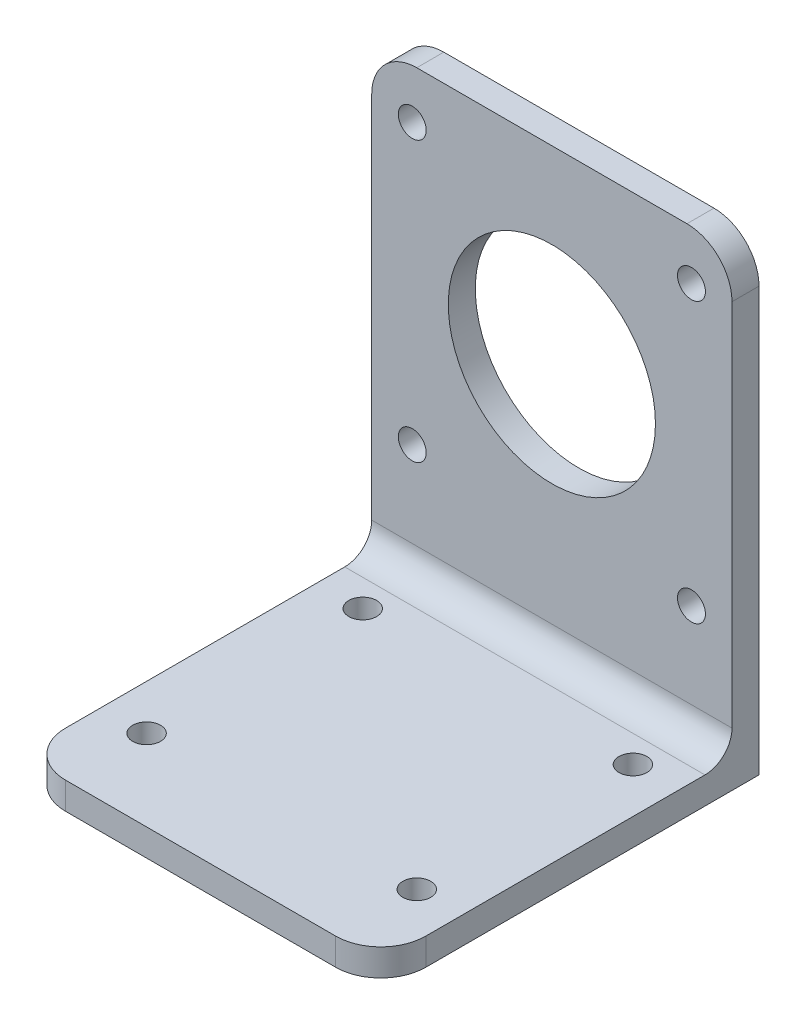
ISO-10303-21;
HEADER;
FILE_DESCRIPTION(('STEP AP214'),'2;1');
FILE_NAME('part.step','',(''),(''),'','','');
FILE_SCHEMA(('AUTOMOTIVE_DESIGN { 1 0 10303 214 1 1 1 1 }'));
ENDSEC;
DATA;
#1=APPLICATION_CONTEXT('core data for automotive mechanical design processes');
#2=APPLICATION_PROTOCOL_DEFINITION('international standard','automotive_design',2000,#1);
#3=PRODUCT_CONTEXT('',#1,'mechanical');
#4=PRODUCT('Part','Part','',(#3));
#5=PRODUCT_RELATED_PRODUCT_CATEGORY('part','',(#4));
#6=PRODUCT_DEFINITION_FORMATION('','',#4);
#7=PRODUCT_DEFINITION_CONTEXT('part definition',#1,'design');
#8=PRODUCT_DEFINITION('design','',#6,#7);
#9=PRODUCT_DEFINITION_SHAPE('','',#8);
#10=(LENGTH_UNIT() NAMED_UNIT(*) SI_UNIT(.MILLI.,.METRE.));
#11=(NAMED_UNIT(*) PLANE_ANGLE_UNIT() SI_UNIT($,.RADIAN.));
#12=(NAMED_UNIT(*) SI_UNIT($,.STERADIAN.) SOLID_ANGLE_UNIT());
#13=UNCERTAINTY_MEASURE_WITH_UNIT(LENGTH_MEASURE(1.E-05),#10,'distance_accuracy_value','');
#14=(GEOMETRIC_REPRESENTATION_CONTEXT(3) GLOBAL_UNCERTAINTY_ASSIGNED_CONTEXT((#13)) GLOBAL_UNIT_ASSIGNED_CONTEXT((#10,
#11,#12)) REPRESENTATION_CONTEXT('',''));
#15=CARTESIAN_POINT('',(0.,0.,0.));
#16=DIRECTION('',(0.,0.,1.));
#17=DIRECTION('',(1.,0.,0.));
#18=AXIS2_PLACEMENT_3D('',#15,#16,#17);
#19=CARTESIAN_POINT('',(0.,3.,0.));
#20=DIRECTION('',(0.,1.,0.));
#21=DIRECTION('',(0.,0.,1.));
#22=AXIS2_PLACEMENT_3D('',#19,#20,#21);
#23=PLANE('',#22);
#24=DIRECTION('',(0.,0.,-1.));
#25=VECTOR('',#24,1.);
#26=CARTESIAN_POINT('',(20.,3.,-21.));
#27=LINE('',#26,#25);
#28=CARTESIAN_POINT('',(20.,3.,16.));
#29=VERTEX_POINT('',#28);
#30=CARTESIAN_POINT('',(20.,3.,-15.));
#31=VERTEX_POINT('',#30);
#32=EDGE_CURVE('E151',#29,#31,#27,.T.);
#33=ORIENTED_EDGE('',*,*,#32,.T.);
#34=DIRECTION('',(1.,0.,0.));
#35=VECTOR('',#34,1.);
#36=CARTESIAN_POINT('',(0.,3.,-15.));
#37=LINE('',#36,#35);
#38=CARTESIAN_POINT('',(-20.,3.,-15.));
#39=VERTEX_POINT('',#38);
#40=EDGE_CURVE('E51',#31,#39,#37,.F.);
#41=ORIENTED_EDGE('',*,*,#40,.T.);
#42=DIRECTION('',(0.,0.,1.));
#43=VECTOR('',#42,1.);
#44=CARTESIAN_POINT('',(-20.,3.,-21.));
#45=LINE('',#44,#43);
#46=CARTESIAN_POINT('',(-20.,3.,16.));
#47=VERTEX_POINT('',#46);
#48=EDGE_CURVE('E233',#39,#47,#45,.T.);
#49=ORIENTED_EDGE('',*,*,#48,.T.);
#50=CARTESIAN_POINT('',(-15.,3.,16.));
#51=DIRECTION('',(0.,1.,0.));
#52=DIRECTION('',(0.,0.,1.));
#53=AXIS2_PLACEMENT_3D('',#50,#51,#52);
#54=CIRCLE('',#53,5.);
#55=CARTESIAN_POINT('',(-15.,3.,21.));
#56=VERTEX_POINT('',#55);
#57=EDGE_CURVE('E183',#47,#56,#54,.T.);
#58=ORIENTED_EDGE('',*,*,#57,.T.);
#59=DIRECTION('',(1.,0.,0.));
#60=VECTOR('',#59,1.);
#61=CARTESIAN_POINT('',(-20.,3.,21.));
#62=LINE('',#61,#60);
#63=CARTESIAN_POINT('',(15.,3.,21.));
#64=VERTEX_POINT('',#63);
#65=EDGE_CURVE('E152',#56,#64,#62,.T.);
#66=ORIENTED_EDGE('',*,*,#65,.T.);
#67=CARTESIAN_POINT('',(15.,3.,16.));
#68=DIRECTION('',(0.,1.,0.));
#69=DIRECTION('',(0.,0.,1.));
#70=AXIS2_PLACEMENT_3D('',#67,#68,#69);
#71=CIRCLE('',#70,5.);
#72=EDGE_CURVE('E185',#64,#29,#71,.T.);
#73=ORIENTED_EDGE('',*,*,#72,.T.);
#74=EDGE_LOOP('',(#33,#41,#49,#58,#66,#73));
#75=FACE_BOUND('',#74,.T.);
#76=CARTESIAN_POINT('',(15.,3.,-12.));
#77=DIRECTION('',(0.,1.,0.));
#78=DIRECTION('',(0.,0.,1.));
#79=AXIS2_PLACEMENT_3D('',#76,#77,#78);
#80=CIRCLE('',#79,1.55);
#81=CARTESIAN_POINT('',(15.,3.,-10.45));
#82=VERTEX_POINT('',#81);
#83=EDGE_CURVE('E216',#82,#82,#80,.T.);
#84=ORIENTED_EDGE('',*,*,#83,.F.);
#85=EDGE_LOOP('',(#84));
#86=FACE_BOUND('',#85,.T.);
#87=CARTESIAN_POINT('',(-15.,3.,12.));
#88=DIRECTION('',(0.,1.,0.));
#89=DIRECTION('',(0.,0.,1.));
#90=AXIS2_PLACEMENT_3D('',#87,#88,#89);
#91=CIRCLE('',#90,1.55);
#92=CARTESIAN_POINT('',(-15.,3.,13.55));
#93=VERTEX_POINT('',#92);
#94=EDGE_CURVE('E128',#93,#93,#91,.T.);
#95=ORIENTED_EDGE('',*,*,#94,.F.);
#96=EDGE_LOOP('',(#95));
#97=FACE_BOUND('',#96,.T.);
#98=CARTESIAN_POINT('',(-15.,3.,-12.));
#99=DIRECTION('',(0.,1.,0.));
#100=DIRECTION('',(0.,0.,1.));
#101=AXIS2_PLACEMENT_3D('',#98,#99,#100);
#102=CIRCLE('',#101,1.55);
#103=CARTESIAN_POINT('',(-15.,3.,-10.45));
#104=VERTEX_POINT('',#103);
#105=EDGE_CURVE('E222',#104,#104,#102,.T.);
#106=ORIENTED_EDGE('',*,*,#105,.F.);
#107=EDGE_LOOP('',(#106));
#108=FACE_BOUND('',#107,.T.);
#109=CARTESIAN_POINT('',(15.,3.,12.));
#110=DIRECTION('',(0.,1.,0.));
#111=DIRECTION('',(0.,0.,1.));
#112=AXIS2_PLACEMENT_3D('',#109,#110,#111);
#113=CIRCLE('',#112,1.55);
#114=CARTESIAN_POINT('',(15.,3.,13.55));
#115=VERTEX_POINT('',#114);
#116=EDGE_CURVE('E210',#115,#115,#113,.T.);
#117=ORIENTED_EDGE('',*,*,#116,.F.);
#118=EDGE_LOOP('',(#117));
#119=FACE_BOUND('',#118,.T.);
#120=ADVANCED_FACE('F36',(#75,#86,#97,#108,#119),#23,.T.);
#121=CARTESIAN_POINT('',(0.,0.,0.));
#122=DIRECTION('',(0.,1.,0.));
#123=DIRECTION('',(0.,0.,1.));
#124=AXIS2_PLACEMENT_3D('',#121,#122,#123);
#125=PLANE('',#124);
#126=DIRECTION('',(0.,0.,-1.));
#127=VECTOR('',#126,1.);
#128=CARTESIAN_POINT('',(20.,0.,-21.));
#129=LINE('',#128,#127);
#130=CARTESIAN_POINT('',(20.,0.,16.));
#131=VERTEX_POINT('',#130);
#132=CARTESIAN_POINT('',(20.,0.,-21.));
#133=VERTEX_POINT('',#132);
#134=EDGE_CURVE('E118',#131,#133,#129,.T.);
#135=ORIENTED_EDGE('',*,*,#134,.F.);
#136=CARTESIAN_POINT('',(15.,0.,16.));
#137=DIRECTION('',(0.,1.,0.));
#138=DIRECTION('',(0.,0.,1.));
#139=AXIS2_PLACEMENT_3D('',#136,#137,#138);
#140=CIRCLE('',#139,5.);
#141=CARTESIAN_POINT('',(15.,0.,21.));
#142=VERTEX_POINT('',#141);
#143=EDGE_CURVE('E176',#131,#142,#140,.F.);
#144=ORIENTED_EDGE('',*,*,#143,.T.);
#145=DIRECTION('',(1.,0.,0.));
#146=VECTOR('',#145,1.);
#147=CARTESIAN_POINT('',(-20.,0.,21.));
#148=LINE('',#147,#146);
#149=CARTESIAN_POINT('',(-15.,0.,21.));
#150=VERTEX_POINT('',#149);
#151=EDGE_CURVE('E145',#150,#142,#148,.T.);
#152=ORIENTED_EDGE('',*,*,#151,.F.);
#153=CARTESIAN_POINT('',(-15.,0.,16.));
#154=DIRECTION('',(0.,1.,0.));
#155=DIRECTION('',(0.,0.,1.));
#156=AXIS2_PLACEMENT_3D('',#153,#154,#155);
#157=CIRCLE('',#156,5.);
#158=CARTESIAN_POINT('',(-20.,0.,16.));
#159=VERTEX_POINT('',#158);
#160=EDGE_CURVE('E174',#150,#159,#157,.F.);
#161=ORIENTED_EDGE('',*,*,#160,.T.);
#162=DIRECTION('',(0.,0.,1.));
#163=VECTOR('',#162,1.);
#164=CARTESIAN_POINT('',(-20.,0.,-21.));
#165=LINE('',#164,#163);
#166=CARTESIAN_POINT('',(-20.,0.,-21.));
#167=VERTEX_POINT('',#166);
#168=EDGE_CURVE('E143',#167,#159,#165,.T.);
#169=ORIENTED_EDGE('',*,*,#168,.F.);
#170=DIRECTION('',(-1.,0.,0.));
#171=VECTOR('',#170,1.);
#172=CARTESIAN_POINT('',(-20.,0.,-21.));
#173=LINE('',#172,#171);
#174=EDGE_CURVE('E127',#133,#167,#173,.T.);
#175=ORIENTED_EDGE('',*,*,#174,.F.);
#176=EDGE_LOOP('',(#135,#144,#152,#161,#169,#175));
#177=FACE_BOUND('',#176,.T.);
#178=CARTESIAN_POINT('',(-15.,0.,12.));
#179=DIRECTION('',(0.,1.,0.));
#180=DIRECTION('',(0.,0.,1.));
#181=AXIS2_PLACEMENT_3D('',#178,#179,#180);
#182=CIRCLE('',#181,1.55);
#183=CARTESIAN_POINT('',(-15.,0.,13.55));
#184=VERTEX_POINT('',#183);
#185=EDGE_CURVE('E225',#184,#184,#182,.T.);
#186=ORIENTED_EDGE('',*,*,#185,.T.);
#187=EDGE_LOOP('',(#186));
#188=FACE_BOUND('',#187,.T.);
#189=CARTESIAN_POINT('',(-15.,0.,-12.));
#190=DIRECTION('',(0.,1.,0.));
#191=DIRECTION('',(0.,0.,1.));
#192=AXIS2_PLACEMENT_3D('',#189,#190,#191);
#193=CIRCLE('',#192,1.55);
#194=CARTESIAN_POINT('',(-15.,0.,-10.45));
#195=VERTEX_POINT('',#194);
#196=EDGE_CURVE('E219',#195,#195,#193,.T.);
#197=ORIENTED_EDGE('',*,*,#196,.T.);
#198=EDGE_LOOP('',(#197));
#199=FACE_BOUND('',#198,.T.);
#200=CARTESIAN_POINT('',(15.,0.,-12.));
#201=DIRECTION('',(0.,1.,0.));
#202=DIRECTION('',(0.,0.,1.));
#203=AXIS2_PLACEMENT_3D('',#200,#201,#202);
#204=CIRCLE('',#203,1.55);
#205=CARTESIAN_POINT('',(15.,0.,-10.45));
#206=VERTEX_POINT('',#205);
#207=EDGE_CURVE('E213',#206,#206,#204,.T.);
#208=ORIENTED_EDGE('',*,*,#207,.T.);
#209=EDGE_LOOP('',(#208));
#210=FACE_BOUND('',#209,.T.);
#211=CARTESIAN_POINT('',(15.,0.,12.));
#212=DIRECTION('',(0.,1.,0.));
#213=DIRECTION('',(0.,0.,1.));
#214=AXIS2_PLACEMENT_3D('',#211,#212,#213);
#215=CIRCLE('',#214,1.55);
#216=CARTESIAN_POINT('',(15.,0.,13.55));
#217=VERTEX_POINT('',#216);
#218=EDGE_CURVE('E203',#217,#217,#215,.T.);
#219=ORIENTED_EDGE('',*,*,#218,.T.);
#220=EDGE_LOOP('',(#219));
#221=FACE_BOUND('',#220,.T.);
#222=ADVANCED_FACE('F140',(#177,#188,#199,#210,#221),#125,.F.);
#223=CARTESIAN_POINT('',(20.,3.,-21.));
#224=DIRECTION('',(-1.,0.,0.));
#225=DIRECTION('',(0.,0.,1.));
#226=AXIS2_PLACEMENT_3D('',#223,#224,#225);
#227=PLANE('',#226);
#228=DIRECTION('',(0.,-1.,0.));
#229=VECTOR('',#228,1.);
#230=CARTESIAN_POINT('',(20.,3.,-21.));
#231=LINE('',#230,#229);
#232=CARTESIAN_POINT('',(20.,47.,-21.));
#233=VERTEX_POINT('',#232);
#234=EDGE_CURVE('E121',#233,#133,#231,.T.);
#235=ORIENTED_EDGE('',*,*,#234,.F.);
#236=DIRECTION('',(0.,0.,-1.));
#237=VECTOR('',#236,1.);
#238=CARTESIAN_POINT('',(20.,47.,-18.));
#239=LINE('',#238,#237);
#240=CARTESIAN_POINT('',(20.,47.,-18.));
#241=VERTEX_POINT('',#240);
#242=EDGE_CURVE('E172',#233,#241,#239,.F.);
#243=ORIENTED_EDGE('',*,*,#242,.T.);
#244=DIRECTION('',(0.,-1.,0.));
#245=VECTOR('',#244,1.);
#246=CARTESIAN_POINT('',(20.,52.,-18.));
#247=LINE('',#246,#245);
#248=CARTESIAN_POINT('',(20.,6.,-18.));
#249=VERTEX_POINT('',#248);
#250=EDGE_CURVE('E195',#241,#249,#247,.T.);
#251=ORIENTED_EDGE('',*,*,#250,.T.);
#252=CARTESIAN_POINT('',(20.,6.,-15.));
#253=DIRECTION('',(-1.,0.,0.));
#254=DIRECTION('',(0.,0.,1.));
#255=AXIS2_PLACEMENT_3D('',#252,#253,#254);
#256=CIRCLE('',#255,3.);
#257=EDGE_CURVE('E44',#249,#31,#256,.T.);
#258=ORIENTED_EDGE('',*,*,#257,.T.);
#259=ORIENTED_EDGE('',*,*,#32,.F.);
#260=DIRECTION('',(0.,-1.,0.));
#261=VECTOR('',#260,1.);
#262=CARTESIAN_POINT('',(20.,3.,16.));
#263=LINE('',#262,#261);
#264=EDGE_CURVE('E124',#29,#131,#263,.T.);
#265=ORIENTED_EDGE('',*,*,#264,.T.);
#266=ORIENTED_EDGE('',*,*,#134,.T.);
#267=EDGE_LOOP('',(#235,#243,#251,#258,#259,#265,#266));
#268=FACE_BOUND('',#267,.T.);
#269=ADVANCED_FACE('F120',(#268),#227,.F.);
#270=CARTESIAN_POINT('',(-20.,3.,-21.));
#271=DIRECTION('',(0.,0.,1.));
#272=DIRECTION('',(1.,0.,0.));
#273=AXIS2_PLACEMENT_3D('',#270,#271,#272);
#274=PLANE('',#273);
#275=CARTESIAN_POINT('',(-15.5,15.5,-21.));
#276=DIRECTION('',(0.,0.,1.));
#277=DIRECTION('',(1.,0.,0.));
#278=AXIS2_PLACEMENT_3D('',#275,#276,#277);
#279=CIRCLE('',#278,1.55);
#280=CARTESIAN_POINT('',(-13.95,15.5,-21.));
#281=VERTEX_POINT('',#280);
#282=EDGE_CURVE('E261',#281,#281,#279,.T.);
#283=ORIENTED_EDGE('',*,*,#282,.T.);
#284=EDGE_LOOP('',(#283));
#285=FACE_BOUND('',#284,.T.);
#286=CARTESIAN_POINT('',(15.5,15.5,-21.));
#287=DIRECTION('',(0.,0.,1.));
#288=DIRECTION('',(1.,0.,0.));
#289=AXIS2_PLACEMENT_3D('',#286,#287,#288);
#290=CIRCLE('',#289,1.55);
#291=CARTESIAN_POINT('',(17.05,15.5,-21.));
#292=VERTEX_POINT('',#291);
#293=EDGE_CURVE('E263',#292,#292,#290,.T.);
#294=ORIENTED_EDGE('',*,*,#293,.T.);
#295=EDGE_LOOP('',(#294));
#296=FACE_BOUND('',#295,.T.);
#297=CARTESIAN_POINT('',(15.5,46.5,-21.));
#298=DIRECTION('',(0.,0.,1.));
#299=DIRECTION('',(1.,0.,0.));
#300=AXIS2_PLACEMENT_3D('',#297,#298,#299);
#301=CIRCLE('',#300,1.55);
#302=CARTESIAN_POINT('',(17.05,46.5,-21.));
#303=VERTEX_POINT('',#302);
#304=EDGE_CURVE('E268',#303,#303,#301,.T.);
#305=ORIENTED_EDGE('',*,*,#304,.T.);
#306=EDGE_LOOP('',(#305));
#307=FACE_BOUND('',#306,.T.);
#308=CARTESIAN_POINT('',(-15.5,46.5,-21.));
#309=DIRECTION('',(0.,0.,1.));
#310=DIRECTION('',(1.,0.,0.));
#311=AXIS2_PLACEMENT_3D('',#308,#309,#310);
#312=CIRCLE('',#311,1.55);
#313=CARTESIAN_POINT('',(-13.95,46.5,-21.));
#314=VERTEX_POINT('',#313);
#315=EDGE_CURVE('E271',#314,#314,#312,.T.);
#316=ORIENTED_EDGE('',*,*,#315,.T.);
#317=EDGE_LOOP('',(#316));
#318=FACE_BOUND('',#317,.T.);
#319=CARTESIAN_POINT('',(0.,31.,-21.));
#320=DIRECTION('',(0.,0.,1.));
#321=DIRECTION('',(1.,0.,0.));
#322=AXIS2_PLACEMENT_3D('',#319,#320,#321);
#323=CIRCLE('',#322,11.5);
#324=CARTESIAN_POINT('',(11.5,31.,-21.));
#325=VERTEX_POINT('',#324);
#326=EDGE_CURVE('E274',#325,#325,#323,.T.);
#327=ORIENTED_EDGE('',*,*,#326,.T.);
#328=EDGE_LOOP('',(#327));
#329=FACE_BOUND('',#328,.T.);
#330=DIRECTION('',(0.,-1.,0.));
#331=VECTOR('',#330,1.);
#332=CARTESIAN_POINT('',(-20.,3.,-21.));
#333=LINE('',#332,#331);
#334=CARTESIAN_POINT('',(-20.,47.,-21.));
#335=VERTEX_POINT('',#334);
#336=EDGE_CURVE('E138',#335,#167,#333,.T.);
#337=ORIENTED_EDGE('',*,*,#336,.F.);
#338=CARTESIAN_POINT('',(-15.,47.,-21.));
#339=DIRECTION('',(0.,0.,1.));
#340=DIRECTION('',(1.,0.,0.));
#341=AXIS2_PLACEMENT_3D('',#338,#339,#340);
#342=CIRCLE('',#341,5.);
#343=CARTESIAN_POINT('',(-15.,52.,-21.));
#344=VERTEX_POINT('',#343);
#345=EDGE_CURVE('E169',#335,#344,#342,.F.);
#346=ORIENTED_EDGE('',*,*,#345,.T.);
#347=DIRECTION('',(-1.,0.,0.));
#348=VECTOR('',#347,1.);
#349=CARTESIAN_POINT('',(-20.,52.,-21.));
#350=LINE('',#349,#348);
#351=CARTESIAN_POINT('',(15.,52.,-21.));
#352=VERTEX_POINT('',#351);
#353=EDGE_CURVE('E201',#352,#344,#350,.T.);
#354=ORIENTED_EDGE('',*,*,#353,.F.);
#355=CARTESIAN_POINT('',(15.,47.,-21.));
#356=DIRECTION('',(0.,0.,1.));
#357=DIRECTION('',(1.,0.,0.));
#358=AXIS2_PLACEMENT_3D('',#355,#356,#357);
#359=CIRCLE('',#358,5.);
#360=EDGE_CURVE('E136',#352,#233,#359,.F.);
#361=ORIENTED_EDGE('',*,*,#360,.T.);
#362=ORIENTED_EDGE('',*,*,#234,.T.);
#363=ORIENTED_EDGE('',*,*,#174,.T.);
#364=EDGE_LOOP('',(#337,#346,#354,#361,#362,#363));
#365=FACE_BOUND('',#364,.T.);
#366=ADVANCED_FACE('F133',(#285,#296,#307,#318,#329,#365),#274,.F.);
#367=CARTESIAN_POINT('',(-20.,3.,-21.));
#368=DIRECTION('',(1.,0.,0.));
#369=DIRECTION('',(0.,0.,-1.));
#370=AXIS2_PLACEMENT_3D('',#367,#368,#369);
#371=PLANE('',#370);
#372=DIRECTION('',(0.,-1.,0.));
#373=VECTOR('',#372,1.);
#374=CARTESIAN_POINT('',(-20.,52.,-18.));
#375=LINE('',#374,#373);
#376=CARTESIAN_POINT('',(-20.,47.,-18.));
#377=VERTEX_POINT('',#376);
#378=CARTESIAN_POINT('',(-20.,6.,-18.));
#379=VERTEX_POINT('',#378);
#380=EDGE_CURVE('E198',#377,#379,#375,.T.);
#381=ORIENTED_EDGE('',*,*,#380,.F.);
#382=DIRECTION('',(0.,0.,1.));
#383=VECTOR('',#382,1.);
#384=CARTESIAN_POINT('',(-20.,47.,-21.));
#385=LINE('',#384,#383);
#386=EDGE_CURVE('E166',#377,#335,#385,.F.);
#387=ORIENTED_EDGE('',*,*,#386,.T.);
#388=ORIENTED_EDGE('',*,*,#336,.T.);
#389=ORIENTED_EDGE('',*,*,#168,.T.);
#390=DIRECTION('',(0.,-1.,0.));
#391=VECTOR('',#390,1.);
#392=CARTESIAN_POINT('',(-20.,3.,16.));
#393=LINE('',#392,#391);
#394=EDGE_CURVE('E163',#159,#47,#393,.F.);
#395=ORIENTED_EDGE('',*,*,#394,.T.);
#396=ORIENTED_EDGE('',*,*,#48,.F.);
#397=CARTESIAN_POINT('',(-20.,6.,-15.));
#398=DIRECTION('',(1.,0.,0.));
#399=DIRECTION('',(0.,0.,-1.));
#400=AXIS2_PLACEMENT_3D('',#397,#398,#399);
#401=CIRCLE('',#400,3.);
#402=EDGE_CURVE('E11',#39,#379,#401,.T.);
#403=ORIENTED_EDGE('',*,*,#402,.T.);
#404=EDGE_LOOP('',(#381,#387,#388,#389,#395,#396,#403));
#405=FACE_BOUND('',#404,.T.);
#406=ADVANCED_FACE('F250',(#405),#371,.F.);
#407=CARTESIAN_POINT('',(-20.,3.,21.));
#408=DIRECTION('',(0.,0.,-1.));
#409=DIRECTION('',(-1.,0.,0.));
#410=AXIS2_PLACEMENT_3D('',#407,#408,#409);
#411=PLANE('',#410);
#412=ORIENTED_EDGE('',*,*,#151,.T.);
#413=DIRECTION('',(0.,-1.,0.));
#414=VECTOR('',#413,1.);
#415=CARTESIAN_POINT('',(15.,3.,21.));
#416=LINE('',#415,#414);
#417=EDGE_CURVE('E181',#142,#64,#416,.F.);
#418=ORIENTED_EDGE('',*,*,#417,.T.);
#419=ORIENTED_EDGE('',*,*,#65,.F.);
#420=DIRECTION('',(0.,-1.,0.));
#421=VECTOR('',#420,1.);
#422=CARTESIAN_POINT('',(-15.,3.,21.));
#423=LINE('',#422,#421);
#424=EDGE_CURVE('E178',#56,#150,#423,.T.);
#425=ORIENTED_EDGE('',*,*,#424,.T.);
#426=EDGE_LOOP('',(#412,#418,#419,#425));
#427=FACE_BOUND('',#426,.T.);
#428=ADVANCED_FACE('F245',(#427),#411,.F.);
#429=CARTESIAN_POINT('',(-15.,3.,12.));
#430=DIRECTION('',(0.,-1.,0.));
#431=DIRECTION('',(0.,0.,-1.));
#432=AXIS2_PLACEMENT_3D('',#429,#430,#431);
#433=CYLINDRICAL_SURFACE('',#432,1.55);
#434=ORIENTED_EDGE('',*,*,#94,.T.);
#435=EDGE_LOOP('',(#434));
#436=FACE_BOUND('',#435,.T.);
#437=ORIENTED_EDGE('',*,*,#185,.F.);
#438=EDGE_LOOP('',(#437));
#439=FACE_BOUND('',#438,.T.);
#440=ADVANCED_FACE('F326',(#436,#439),#433,.F.);
#441=CARTESIAN_POINT('',(-15.,3.,-12.));
#442=DIRECTION('',(0.,-1.,0.));
#443=DIRECTION('',(0.,0.,-1.));
#444=AXIS2_PLACEMENT_3D('',#441,#442,#443);
#445=CYLINDRICAL_SURFACE('',#444,1.55);
#446=ORIENTED_EDGE('',*,*,#105,.T.);
#447=EDGE_LOOP('',(#446));
#448=FACE_BOUND('',#447,.T.);
#449=ORIENTED_EDGE('',*,*,#196,.F.);
#450=EDGE_LOOP('',(#449));
#451=FACE_BOUND('',#450,.T.);
#452=ADVANCED_FACE('F333',(#448,#451),#445,.F.);
#453=CARTESIAN_POINT('',(15.,3.,-12.));
#454=DIRECTION('',(0.,-1.,0.));
#455=DIRECTION('',(0.,0.,-1.));
#456=AXIS2_PLACEMENT_3D('',#453,#454,#455);
#457=CYLINDRICAL_SURFACE('',#456,1.55);
#458=ORIENTED_EDGE('',*,*,#83,.T.);
#459=EDGE_LOOP('',(#458));
#460=FACE_BOUND('',#459,.T.);
#461=ORIENTED_EDGE('',*,*,#207,.F.);
#462=EDGE_LOOP('',(#461));
#463=FACE_BOUND('',#462,.T.);
#464=ADVANCED_FACE('F338',(#460,#463),#457,.F.);
#465=CARTESIAN_POINT('',(15.,3.,12.));
#466=DIRECTION('',(0.,-1.,0.));
#467=DIRECTION('',(0.,0.,-1.));
#468=AXIS2_PLACEMENT_3D('',#465,#466,#467);
#469=CYLINDRICAL_SURFACE('',#468,1.55);
#470=ORIENTED_EDGE('',*,*,#116,.T.);
#471=EDGE_LOOP('',(#470));
#472=FACE_BOUND('',#471,.T.);
#473=ORIENTED_EDGE('',*,*,#218,.F.);
#474=EDGE_LOOP('',(#473));
#475=FACE_BOUND('',#474,.T.);
#476=ADVANCED_FACE('F298',(#472,#475),#469,.F.);
#477=CARTESIAN_POINT('',(-20.,52.,-18.));
#478=DIRECTION('',(0.,0.,-1.));
#479=DIRECTION('',(-1.,0.,0.));
#480=AXIS2_PLACEMENT_3D('',#477,#478,#479);
#481=PLANE('',#480);
#482=CARTESIAN_POINT('',(-15.5,15.5,-18.));
#483=DIRECTION('',(0.,0.,1.));
#484=DIRECTION('',(1.,0.,0.));
#485=AXIS2_PLACEMENT_3D('',#482,#483,#484);
#486=CIRCLE('',#485,1.55);
#487=CARTESIAN_POINT('',(-13.95,15.5,-18.));
#488=VERTEX_POINT('',#487);
#489=EDGE_CURVE('E281',#488,#488,#486,.T.);
#490=ORIENTED_EDGE('',*,*,#489,.F.);
#491=EDGE_LOOP('',(#490));
#492=FACE_BOUND('',#491,.T.);
#493=CARTESIAN_POINT('',(15.5,15.5,-18.));
#494=DIRECTION('',(0.,0.,1.));
#495=DIRECTION('',(1.,0.,0.));
#496=AXIS2_PLACEMENT_3D('',#493,#494,#495);
#497=CIRCLE('',#496,1.55);
#498=CARTESIAN_POINT('',(17.05,15.5,-18.));
#499=VERTEX_POINT('',#498);
#500=EDGE_CURVE('E284',#499,#499,#497,.T.);
#501=ORIENTED_EDGE('',*,*,#500,.F.);
#502=EDGE_LOOP('',(#501));
#503=FACE_BOUND('',#502,.T.);
#504=CARTESIAN_POINT('',(15.5,46.5,-18.));
#505=DIRECTION('',(0.,0.,1.));
#506=DIRECTION('',(1.,0.,0.));
#507=AXIS2_PLACEMENT_3D('',#504,#505,#506);
#508=CIRCLE('',#507,1.55);
#509=CARTESIAN_POINT('',(17.05,46.5,-18.));
#510=VERTEX_POINT('',#509);
#511=EDGE_CURVE('E287',#510,#510,#508,.T.);
#512=ORIENTED_EDGE('',*,*,#511,.F.);
#513=EDGE_LOOP('',(#512));
#514=FACE_BOUND('',#513,.T.);
#515=CARTESIAN_POINT('',(-15.5,46.5,-18.));
#516=DIRECTION('',(0.,0.,1.));
#517=DIRECTION('',(1.,0.,0.));
#518=AXIS2_PLACEMENT_3D('',#515,#516,#517);
#519=CIRCLE('',#518,1.55);
#520=CARTESIAN_POINT('',(-13.95,46.5,-18.));
#521=VERTEX_POINT('',#520);
#522=EDGE_CURVE('E280',#521,#521,#519,.T.);
#523=ORIENTED_EDGE('',*,*,#522,.F.);
#524=EDGE_LOOP('',(#523));
#525=FACE_BOUND('',#524,.T.);
#526=CARTESIAN_POINT('',(0.,31.,-18.));
#527=DIRECTION('',(0.,0.,1.));
#528=DIRECTION('',(1.,0.,0.));
#529=AXIS2_PLACEMENT_3D('',#526,#527,#528);
#530=CIRCLE('',#529,11.5);
#531=CARTESIAN_POINT('',(11.5,31.,-18.));
#532=VERTEX_POINT('',#531);
#533=EDGE_CURVE('E277',#532,#532,#530,.T.);
#534=ORIENTED_EDGE('',*,*,#533,.F.);
#535=EDGE_LOOP('',(#534));
#536=FACE_BOUND('',#535,.T.);
#537=ORIENTED_EDGE('',*,*,#380,.T.);
#538=DIRECTION('',(1.,0.,0.));
#539=VECTOR('',#538,1.);
#540=CARTESIAN_POINT('',(-20.,6.,-18.));
#541=LINE('',#540,#539);
#542=EDGE_CURVE('E187',#379,#249,#541,.T.);
#543=ORIENTED_EDGE('',*,*,#542,.T.);
#544=ORIENTED_EDGE('',*,*,#250,.F.);
#545=CARTESIAN_POINT('',(15.,47.,-18.));
#546=DIRECTION('',(0.,0.,-1.));
#547=DIRECTION('',(-1.,0.,0.));
#548=AXIS2_PLACEMENT_3D('',#545,#546,#547);
#549=CIRCLE('',#548,5.);
#550=CARTESIAN_POINT('',(15.,52.,-18.));
#551=VERTEX_POINT('',#550);
#552=EDGE_CURVE('E159',#241,#551,#549,.F.);
#553=ORIENTED_EDGE('',*,*,#552,.T.);
#554=DIRECTION('',(1.,0.,0.));
#555=VECTOR('',#554,1.);
#556=CARTESIAN_POINT('',(-20.,52.,-18.));
#557=LINE('',#556,#555);
#558=CARTESIAN_POINT('',(-15.,52.,-18.));
#559=VERTEX_POINT('',#558);
#560=EDGE_CURVE('E206',#559,#551,#557,.T.);
#561=ORIENTED_EDGE('',*,*,#560,.F.);
#562=CARTESIAN_POINT('',(-15.,47.,-18.));
#563=DIRECTION('',(0.,0.,-1.));
#564=DIRECTION('',(-1.,0.,0.));
#565=AXIS2_PLACEMENT_3D('',#562,#563,#564);
#566=CIRCLE('',#565,5.);
#567=EDGE_CURVE('E161',#559,#377,#566,.F.);
#568=ORIENTED_EDGE('',*,*,#567,.T.);
#569=EDGE_LOOP('',(#537,#543,#544,#553,#561,#568));
#570=FACE_BOUND('',#569,.T.);
#571=ADVANCED_FACE('F194',(#492,#503,#514,#525,#536,#570),#481,.F.);
#572=CARTESIAN_POINT('',(0.,52.,0.));
#573=DIRECTION('',(0.,1.,0.));
#574=DIRECTION('',(0.,0.,1.));
#575=AXIS2_PLACEMENT_3D('',#572,#573,#574);
#576=PLANE('',#575);
#577=ORIENTED_EDGE('',*,*,#353,.T.);
#578=DIRECTION('',(0.,0.,1.));
#579=VECTOR('',#578,1.);
#580=CARTESIAN_POINT('',(-15.,52.,-18.));
#581=LINE('',#580,#579);
#582=EDGE_CURVE('E156',#344,#559,#581,.T.);
#583=ORIENTED_EDGE('',*,*,#582,.T.);
#584=ORIENTED_EDGE('',*,*,#560,.T.);
#585=DIRECTION('',(0.,0.,-1.));
#586=VECTOR('',#585,1.);
#587=CARTESIAN_POINT('',(15.,52.,-21.));
#588=LINE('',#587,#586);
#589=EDGE_CURVE('E137',#551,#352,#588,.T.);
#590=ORIENTED_EDGE('',*,*,#589,.T.);
#591=EDGE_LOOP('',(#577,#583,#584,#590));
#592=FACE_BOUND('',#591,.T.);
#593=ADVANCED_FACE('F259',(#592),#576,.T.);
#594=CARTESIAN_POINT('',(0.,31.,-67.));
#595=DIRECTION('',(0.,0.,1.));
#596=DIRECTION('',(1.,0.,0.));
#597=AXIS2_PLACEMENT_3D('',#594,#595,#596);
#598=CYLINDRICAL_SURFACE('',#597,11.5);
#599=ORIENTED_EDGE('',*,*,#533,.T.);
#600=EDGE_LOOP('',(#599));
#601=FACE_BOUND('',#600,.T.);
#602=ORIENTED_EDGE('',*,*,#326,.F.);
#603=EDGE_LOOP('',(#602));
#604=FACE_BOUND('',#603,.T.);
#605=ADVANCED_FACE('F303',(#601,#604),#598,.F.);
#606=CARTESIAN_POINT('',(-15.5,46.5,-67.));
#607=DIRECTION('',(0.,0.,1.));
#608=DIRECTION('',(1.,0.,0.));
#609=AXIS2_PLACEMENT_3D('',#606,#607,#608);
#610=CYLINDRICAL_SURFACE('',#609,1.55);
#611=ORIENTED_EDGE('',*,*,#522,.T.);
#612=EDGE_LOOP('',(#611));
#613=FACE_BOUND('',#612,.T.);
#614=ORIENTED_EDGE('',*,*,#315,.F.);
#615=EDGE_LOOP('',(#614));
#616=FACE_BOUND('',#615,.T.);
#617=ADVANCED_FACE('F293',(#613,#616),#610,.F.);
#618=CARTESIAN_POINT('',(15.5,46.5,-67.));
#619=DIRECTION('',(0.,0.,1.));
#620=DIRECTION('',(1.,0.,0.));
#621=AXIS2_PLACEMENT_3D('',#618,#619,#620);
#622=CYLINDRICAL_SURFACE('',#621,1.55);
#623=ORIENTED_EDGE('',*,*,#511,.T.);
#624=EDGE_LOOP('',(#623));
#625=FACE_BOUND('',#624,.T.);
#626=ORIENTED_EDGE('',*,*,#304,.F.);
#627=EDGE_LOOP('',(#626));
#628=FACE_BOUND('',#627,.T.);
#629=ADVANCED_FACE('F368',(#625,#628),#622,.F.);
#630=CARTESIAN_POINT('',(15.5,15.5,-67.));
#631=DIRECTION('',(0.,0.,1.));
#632=DIRECTION('',(1.,0.,0.));
#633=AXIS2_PLACEMENT_3D('',#630,#631,#632);
#634=CYLINDRICAL_SURFACE('',#633,1.55);
#635=ORIENTED_EDGE('',*,*,#500,.T.);
#636=EDGE_LOOP('',(#635));
#637=FACE_BOUND('',#636,.T.);
#638=ORIENTED_EDGE('',*,*,#293,.F.);
#639=EDGE_LOOP('',(#638));
#640=FACE_BOUND('',#639,.T.);
#641=ADVANCED_FACE('F364',(#637,#640),#634,.F.);
#642=CARTESIAN_POINT('',(-15.5,15.5,-67.));
#643=DIRECTION('',(0.,0.,1.));
#644=DIRECTION('',(1.,0.,0.));
#645=AXIS2_PLACEMENT_3D('',#642,#643,#644);
#646=CYLINDRICAL_SURFACE('',#645,1.55);
#647=ORIENTED_EDGE('',*,*,#489,.T.);
#648=EDGE_LOOP('',(#647));
#649=FACE_BOUND('',#648,.T.);
#650=ORIENTED_EDGE('',*,*,#282,.F.);
#651=EDGE_LOOP('',(#650));
#652=FACE_BOUND('',#651,.T.);
#653=ADVANCED_FACE('F361',(#649,#652),#646,.F.);
#654=CARTESIAN_POINT('',(-15.,47.,0.));
#655=DIRECTION('',(0.,0.,-1.));
#656=DIRECTION('',(-1.,0.,0.));
#657=AXIS2_PLACEMENT_3D('',#654,#655,#656);
#658=CYLINDRICAL_SURFACE('',#657,5.);
#659=ORIENTED_EDGE('',*,*,#345,.F.);
#660=ORIENTED_EDGE('',*,*,#386,.F.);
#661=ORIENTED_EDGE('',*,*,#567,.F.);
#662=ORIENTED_EDGE('',*,*,#582,.F.);
#663=EDGE_LOOP('',(#659,#660,#661,#662));
#664=FACE_BOUND('',#663,.T.);
#665=ADVANCED_FACE('F255',(#664),#658,.T.);
#666=CARTESIAN_POINT('',(15.,47.,0.));
#667=DIRECTION('',(0.,0.,1.));
#668=DIRECTION('',(1.,0.,0.));
#669=AXIS2_PLACEMENT_3D('',#666,#667,#668);
#670=CYLINDRICAL_SURFACE('',#669,5.);
#671=ORIENTED_EDGE('',*,*,#552,.F.);
#672=ORIENTED_EDGE('',*,*,#242,.F.);
#673=ORIENTED_EDGE('',*,*,#360,.F.);
#674=ORIENTED_EDGE('',*,*,#589,.F.);
#675=EDGE_LOOP('',(#671,#672,#673,#674));
#676=FACE_BOUND('',#675,.T.);
#677=ADVANCED_FACE('F397',(#676),#670,.T.);
#678=CARTESIAN_POINT('',(15.,3.,16.));
#679=DIRECTION('',(0.,-1.,0.));
#680=DIRECTION('',(0.,0.,-1.));
#681=AXIS2_PLACEMENT_3D('',#678,#679,#680);
#682=CYLINDRICAL_SURFACE('',#681,5.);
#683=ORIENTED_EDGE('',*,*,#72,.F.);
#684=ORIENTED_EDGE('',*,*,#417,.F.);
#685=ORIENTED_EDGE('',*,*,#143,.F.);
#686=ORIENTED_EDGE('',*,*,#264,.F.);
#687=EDGE_LOOP('',(#683,#684,#685,#686));
#688=FACE_BOUND('',#687,.T.);
#689=ADVANCED_FACE('F243',(#688),#682,.T.);
#690=CARTESIAN_POINT('',(-15.,3.,16.));
#691=DIRECTION('',(0.,-1.,0.));
#692=DIRECTION('',(0.,0.,-1.));
#693=AXIS2_PLACEMENT_3D('',#690,#691,#692);
#694=CYLINDRICAL_SURFACE('',#693,5.);
#695=ORIENTED_EDGE('',*,*,#57,.F.);
#696=ORIENTED_EDGE('',*,*,#394,.F.);
#697=ORIENTED_EDGE('',*,*,#160,.F.);
#698=ORIENTED_EDGE('',*,*,#424,.F.);
#699=EDGE_LOOP('',(#695,#696,#697,#698));
#700=FACE_BOUND('',#699,.T.);
#701=ADVANCED_FACE('F247',(#700),#694,.T.);
#702=CARTESIAN_POINT('',(-20.,6.,-15.));
#703=DIRECTION('',(1.,0.,0.));
#704=DIRECTION('',(0.,0.,-1.));
#705=AXIS2_PLACEMENT_3D('',#702,#703,#704);
#706=CYLINDRICAL_SURFACE('',#705,3.);
#707=ORIENTED_EDGE('',*,*,#402,.F.);
#708=ORIENTED_EDGE('',*,*,#40,.F.);
#709=ORIENTED_EDGE('',*,*,#257,.F.);
#710=ORIENTED_EDGE('',*,*,#542,.F.);
#711=EDGE_LOOP('',(#707,#708,#709,#710));
#712=FACE_BOUND('',#711,.T.);
#713=ADVANCED_FACE('F38',(#712),#706,.F.);
#714=CLOSED_SHELL('',(#120,#222,#269,#366,#406,#428,#440,#452,#464,#476,#571,#593,#605,#617,
#629,#641,#653,#665,#677,#689,#701,#713));
#715=MANIFOLD_SOLID_BREP('B2',#714);
#716=ADVANCED_BREP_SHAPE_REPRESENTATION('',(#18,#715),#14);
#717=SHAPE_DEFINITION_REPRESENTATION(#9,#716);
ENDSEC;
END-ISO-10303-21;
